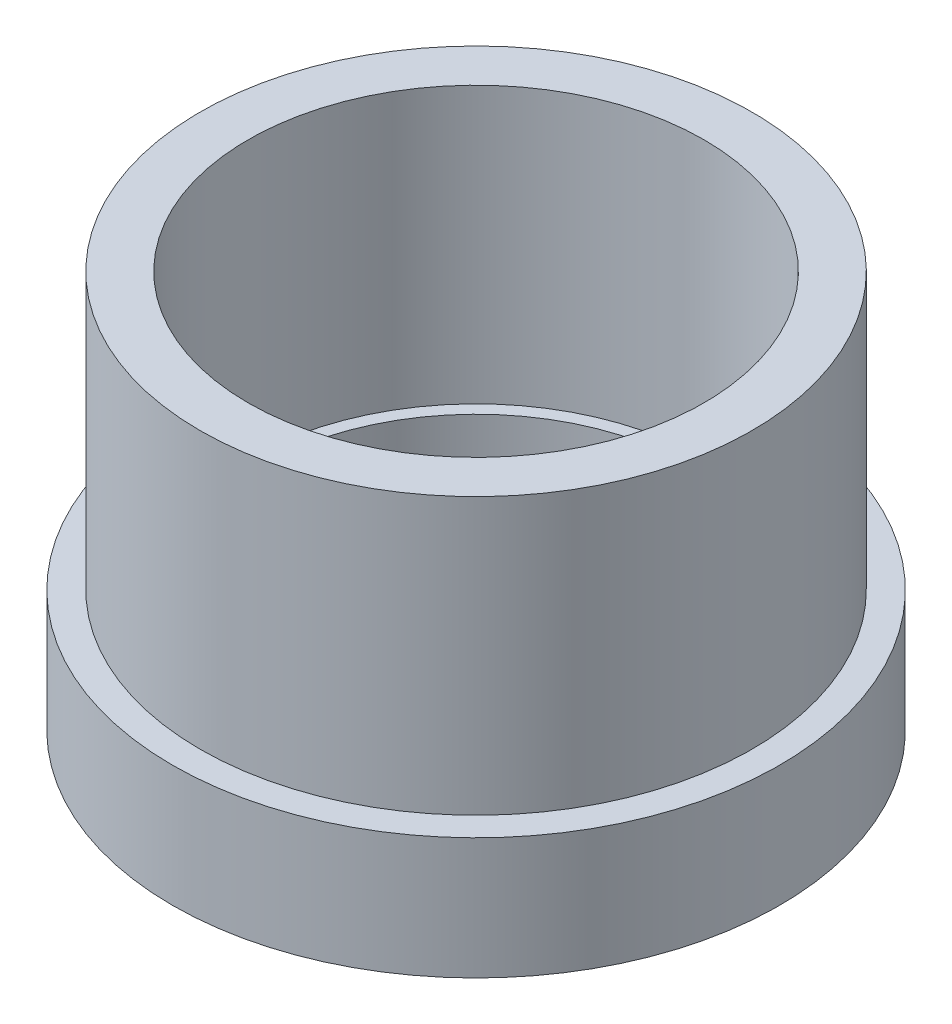
ISO-10303-21;
HEADER;
FILE_DESCRIPTION(('STEP AP214'),'2;1');
FILE_NAME('part.step','',(''),(''),'','','');
FILE_SCHEMA(('AUTOMOTIVE_DESIGN { 1 0 10303 214 1 1 1 1 }'));
ENDSEC;
DATA;
#1=APPLICATION_CONTEXT('core data for automotive mechanical design processes');
#2=APPLICATION_PROTOCOL_DEFINITION('international standard','automotive_design',2000,#1);
#3=PRODUCT_CONTEXT('',#1,'mechanical');
#4=PRODUCT('Part','Part','',(#3));
#5=PRODUCT_RELATED_PRODUCT_CATEGORY('part','',(#4));
#6=PRODUCT_DEFINITION_FORMATION('','',#4);
#7=PRODUCT_DEFINITION_CONTEXT('part definition',#1,'design');
#8=PRODUCT_DEFINITION('design','',#6,#7);
#9=PRODUCT_DEFINITION_SHAPE('','',#8);
#10=(LENGTH_UNIT() NAMED_UNIT(*) SI_UNIT(.MILLI.,.METRE.));
#11=(NAMED_UNIT(*) PLANE_ANGLE_UNIT() SI_UNIT($,.RADIAN.));
#12=(NAMED_UNIT(*) SI_UNIT($,.STERADIAN.) SOLID_ANGLE_UNIT());
#13=UNCERTAINTY_MEASURE_WITH_UNIT(LENGTH_MEASURE(1.E-05),#10,'distance_accuracy_value','');
#14=(GEOMETRIC_REPRESENTATION_CONTEXT(3) GLOBAL_UNCERTAINTY_ASSIGNED_CONTEXT((#13)) GLOBAL_UNIT_ASSIGNED_CONTEXT((#10,
#11,#12)) REPRESENTATION_CONTEXT('',''));
#15=CARTESIAN_POINT('',(0.,0.,0.));
#16=DIRECTION('',(0.,0.,1.));
#17=DIRECTION('',(1.,0.,0.));
#18=AXIS2_PLACEMENT_3D('',#15,#16,#17);
#19=CARTESIAN_POINT('',(39.,10.,0.));
#20=DIRECTION('',(0.,-1.,0.));
#21=DIRECTION('',(0.,0.,-1.));
#22=AXIS2_PLACEMENT_3D('',#19,#20,#21);
#23=PLANE('',#22);
#24=CARTESIAN_POINT('',(0.,9.99999999999999,0.));
#25=DIRECTION('',(0.,1.,0.));
#26=DIRECTION('',(0.,0.,1.));
#27=AXIS2_PLACEMENT_3D('',#24,#25,#26);
#28=CIRCLE('',#27,39.);
#29=CARTESIAN_POINT('',(0.,9.99999999999999,39.));
#30=VERTEX_POINT('',#29);
#31=EDGE_CURVE('E57',#30,#30,#28,.T.);
#32=ORIENTED_EDGE('',*,*,#31,.F.);
#33=EDGE_LOOP('',(#32));
#34=FACE_BOUND('',#33,.T.);
#35=CARTESIAN_POINT('',(0.,10.,0.));
#36=DIRECTION('',(0.,1.,0.));
#37=DIRECTION('',(0.,0.,1.));
#38=AXIS2_PLACEMENT_3D('',#35,#36,#37);
#39=CIRCLE('',#38,41.3);
#40=CARTESIAN_POINT('',(0.,10.,41.3));
#41=VERTEX_POINT('',#40);
#42=EDGE_CURVE('E89',#41,#41,#39,.T.);
#43=ORIENTED_EDGE('',*,*,#42,.T.);
#44=EDGE_LOOP('',(#43));
#45=FACE_BOUND('',#44,.T.);
#46=ADVANCED_FACE('F43',(#34,#45),#23,.F.);
#47=CARTESIAN_POINT('',(41.5,0.,0.));
#48=DIRECTION('',(0.,1.,0.));
#49=DIRECTION('',(0.,0.,1.));
#50=AXIS2_PLACEMENT_3D('',#47,#48,#49);
#51=PLANE('',#50);
#52=CARTESIAN_POINT('',(0.,0.,0.));
#53=DIRECTION('',(0.,1.,0.));
#54=DIRECTION('',(0.,0.,1.));
#55=AXIS2_PLACEMENT_3D('',#52,#53,#54);
#56=CIRCLE('',#55,41.5);
#57=CARTESIAN_POINT('',(0.,0.,41.5));
#58=VERTEX_POINT('',#57);
#59=EDGE_CURVE('E62',#58,#58,#56,.T.);
#60=ORIENTED_EDGE('',*,*,#59,.F.);
#61=EDGE_LOOP('',(#60));
#62=FACE_BOUND('',#61,.T.);
#63=CARTESIAN_POINT('',(0.,0.,0.));
#64=DIRECTION('',(0.,1.,0.));
#65=DIRECTION('',(0.,0.,1.));
#66=AXIS2_PLACEMENT_3D('',#63,#64,#65);
#67=CIRCLE('',#66,39.);
#68=CARTESIAN_POINT('',(0.,0.,39.));
#69=VERTEX_POINT('',#68);
#70=EDGE_CURVE('E47',#69,#69,#67,.T.);
#71=ORIENTED_EDGE('',*,*,#70,.T.);
#72=EDGE_LOOP('',(#71));
#73=FACE_BOUND('',#72,.T.);
#74=ADVANCED_FACE('F45',(#62,#73),#51,.F.);
#75=CARTESIAN_POINT('',(0.,83.5208362070746,0.));
#76=DIRECTION('',(0.,1.,0.));
#77=DIRECTION('',(0.,0.,1.));
#78=AXIS2_PLACEMENT_3D('',#75,#76,#77);
#79=CYLINDRICAL_SURFACE('',#78,39.);
#80=ORIENTED_EDGE('',*,*,#70,.F.);
#81=EDGE_LOOP('',(#80));
#82=FACE_BOUND('',#81,.T.);
#83=ORIENTED_EDGE('',*,*,#31,.T.);
#84=EDGE_LOOP('',(#83));
#85=FACE_BOUND('',#84,.T.);
#86=ADVANCED_FACE('F81',(#82,#85),#79,.F.);
#87=CARTESIAN_POINT('',(0.,10.,0.));
#88=DIRECTION('',(0.,1.,0.));
#89=DIRECTION('',(0.,0.,1.));
#90=AXIS2_PLACEMENT_3D('',#87,#88,#89);
#91=CIRCLE('',#90,50.);
#92=CARTESIAN_POINT('',(0.,10.,50.));
#93=VERTEX_POINT('',#92);
#94=EDGE_CURVE('E10',#93,#93,#91,.T.);
#95=ORIENTED_EDGE('',*,*,#94,.F.);
#96=EDGE_LOOP('',(#95));
#97=FACE_BOUND('',#96,.T.);
#98=CARTESIAN_POINT('',(0.,9.99999999999999,0.));
#99=DIRECTION('',(0.,1.,0.));
#100=DIRECTION('',(0.,0.,1.));
#101=AXIS2_PLACEMENT_3D('',#98,#99,#100);
#102=CIRCLE('',#101,55.);
#103=CARTESIAN_POINT('',(0.,9.99999999999999,55.));
#104=VERTEX_POINT('',#103);
#105=EDGE_CURVE('E74',#104,#104,#102,.T.);
#106=ORIENTED_EDGE('',*,*,#105,.T.);
#107=EDGE_LOOP('',(#106));
#108=FACE_BOUND('',#107,.T.);
#109=ADVANCED_FACE('F86',(#97,#108),#23,.F.);
#110=CARTESIAN_POINT('',(0.,83.5208362070746,0.));
#111=DIRECTION('',(0.,1.,0.));
#112=DIRECTION('',(0.,0.,1.));
#113=AXIS2_PLACEMENT_3D('',#110,#111,#112);
#114=CYLINDRICAL_SURFACE('',#113,55.);
#115=ORIENTED_EDGE('',*,*,#105,.F.);
#116=EDGE_LOOP('',(#115));
#117=FACE_BOUND('',#116,.T.);
#118=CARTESIAN_POINT('',(0.,-12.,0.));
#119=DIRECTION('',(0.,1.,0.));
#120=DIRECTION('',(0.,0.,1.));
#121=AXIS2_PLACEMENT_3D('',#118,#119,#120);
#122=CIRCLE('',#121,55.);
#123=CARTESIAN_POINT('',(0.,-12.,55.));
#124=VERTEX_POINT('',#123);
#125=EDGE_CURVE('E70',#124,#124,#122,.T.);
#126=ORIENTED_EDGE('',*,*,#125,.T.);
#127=EDGE_LOOP('',(#126));
#128=FACE_BOUND('',#127,.T.);
#129=ADVANCED_FACE('F136',(#117,#128),#114,.T.);
#130=CARTESIAN_POINT('',(55.,-12.,0.));
#131=DIRECTION('',(0.,1.,0.));
#132=DIRECTION('',(0.,0.,1.));
#133=AXIS2_PLACEMENT_3D('',#130,#131,#132);
#134=PLANE('',#133);
#135=CARTESIAN_POINT('',(0.,-12.,48.25));
#136=DIRECTION('',(0.,-1.,0.));
#137=DIRECTION('',(0.,0.,-1.));
#138=AXIS2_PLACEMENT_3D('',#135,#136,#137);
#139=CIRCLE('',#138,1.6);
#140=CARTESIAN_POINT('',(0.,-12.,46.65));
#141=VERTEX_POINT('',#140);
#142=EDGE_CURVE('E99',#141,#141,#139,.T.);
#143=ORIENTED_EDGE('',*,*,#142,.F.);
#144=EDGE_LOOP('',(#143));
#145=FACE_BOUND('',#144,.T.);
#146=CARTESIAN_POINT('',(-48.25,-12.,5.05391923797544E-13));
#147=DIRECTION('',(0.,-1.,0.));
#148=DIRECTION('',(0.,0.,-1.));
#149=AXIS2_PLACEMENT_3D('',#146,#147,#148);
#150=CIRCLE('',#149,1.6);
#151=CARTESIAN_POINT('',(-48.25,-12.,-1.59999999999949));
#152=VERTEX_POINT('',#151);
#153=EDGE_CURVE('E122',#152,#152,#150,.T.);
#154=ORIENTED_EDGE('',*,*,#153,.F.);
#155=EDGE_LOOP('',(#154));
#156=FACE_BOUND('',#155,.T.);
#157=CARTESIAN_POINT('',(-3.36927949198362E-13,-12.,-48.25));
#158=DIRECTION('',(0.,-1.,0.));
#159=DIRECTION('',(0.,0.,-1.));
#160=AXIS2_PLACEMENT_3D('',#157,#158,#159);
#161=CIRCLE('',#160,1.6);
#162=CARTESIAN_POINT('',(-3.36927949198362E-13,-12.,-49.85));
#163=VERTEX_POINT('',#162);
#164=EDGE_CURVE('E114',#163,#163,#161,.T.);
#165=ORIENTED_EDGE('',*,*,#164,.F.);
#166=EDGE_LOOP('',(#165));
#167=FACE_BOUND('',#166,.T.);
#168=CARTESIAN_POINT('',(48.25,-12.,-1.68463974599181E-13));
#169=DIRECTION('',(0.,-1.,0.));
#170=DIRECTION('',(0.,0.,-1.));
#171=AXIS2_PLACEMENT_3D('',#168,#169,#170);
#172=CIRCLE('',#171,1.6);
#173=CARTESIAN_POINT('',(48.25,-12.,-1.60000000000017));
#174=VERTEX_POINT('',#173);
#175=EDGE_CURVE('E106',#174,#174,#172,.T.);
#176=ORIENTED_EDGE('',*,*,#175,.F.);
#177=EDGE_LOOP('',(#176));
#178=FACE_BOUND('',#177,.T.);
#179=ORIENTED_EDGE('',*,*,#125,.F.);
#180=EDGE_LOOP('',(#179));
#181=FACE_BOUND('',#180,.T.);
#182=CARTESIAN_POINT('',(0.,-12.,0.));
#183=DIRECTION('',(0.,1.,0.));
#184=DIRECTION('',(0.,0.,1.));
#185=AXIS2_PLACEMENT_3D('',#182,#183,#184);
#186=CIRCLE('',#185,41.5);
#187=CARTESIAN_POINT('',(0.,-12.,41.5));
#188=VERTEX_POINT('',#187);
#189=EDGE_CURVE('E66',#188,#188,#186,.T.);
#190=ORIENTED_EDGE('',*,*,#189,.T.);
#191=EDGE_LOOP('',(#190));
#192=FACE_BOUND('',#191,.T.);
#193=ADVANCED_FACE('F132',(#145,#156,#167,#178,#181,#192),#134,.F.);
#194=CARTESIAN_POINT('',(0.,83.5208362070746,0.));
#195=DIRECTION('',(0.,1.,0.));
#196=DIRECTION('',(0.,0.,1.));
#197=AXIS2_PLACEMENT_3D('',#194,#195,#196);
#198=CYLINDRICAL_SURFACE('',#197,41.5);
#199=ORIENTED_EDGE('',*,*,#189,.F.);
#200=EDGE_LOOP('',(#199));
#201=FACE_BOUND('',#200,.T.);
#202=ORIENTED_EDGE('',*,*,#59,.T.);
#203=EDGE_LOOP('',(#202));
#204=FACE_BOUND('',#203,.T.);
#205=ADVANCED_FACE('F135',(#201,#204),#198,.F.);
#206=CARTESIAN_POINT('',(0.,60.,0.));
#207=DIRECTION('',(0.,1.,0.));
#208=DIRECTION('',(0.,0.,1.));
#209=AXIS2_PLACEMENT_3D('',#206,#207,#208);
#210=PLANE('',#209);
#211=CARTESIAN_POINT('',(0.,60.,0.));
#212=DIRECTION('',(0.,1.,0.));
#213=DIRECTION('',(0.,0.,1.));
#214=AXIS2_PLACEMENT_3D('',#211,#212,#213);
#215=CIRCLE('',#214,50.);
#216=CARTESIAN_POINT('',(0.,60.,50.));
#217=VERTEX_POINT('',#216);
#218=EDGE_CURVE('E60',#217,#217,#215,.T.);
#219=ORIENTED_EDGE('',*,*,#218,.T.);
#220=EDGE_LOOP('',(#219));
#221=FACE_BOUND('',#220,.T.);
#222=CARTESIAN_POINT('',(0.,60.,0.));
#223=DIRECTION('',(0.,1.,0.));
#224=DIRECTION('',(0.,0.,1.));
#225=AXIS2_PLACEMENT_3D('',#222,#223,#224);
#226=CIRCLE('',#225,41.3);
#227=CARTESIAN_POINT('',(0.,60.,41.3));
#228=VERTEX_POINT('',#227);
#229=EDGE_CURVE('E92',#228,#228,#226,.T.);
#230=ORIENTED_EDGE('',*,*,#229,.F.);
#231=EDGE_LOOP('',(#230));
#232=FACE_BOUND('',#231,.T.);
#233=ADVANCED_FACE('F150',(#221,#232),#210,.T.);
#234=CARTESIAN_POINT('',(0.,60.,0.));
#235=DIRECTION('',(0.,-1.,0.));
#236=DIRECTION('',(0.,0.,-1.));
#237=AXIS2_PLACEMENT_3D('',#234,#235,#236);
#238=CYLINDRICAL_SURFACE('',#237,50.);
#239=ORIENTED_EDGE('',*,*,#218,.F.);
#240=EDGE_LOOP('',(#239));
#241=FACE_BOUND('',#240,.T.);
#242=ORIENTED_EDGE('',*,*,#94,.T.);
#243=EDGE_LOOP('',(#242));
#244=FACE_BOUND('',#243,.T.);
#245=ADVANCED_FACE('F167',(#241,#244),#238,.T.);
#246=CARTESIAN_POINT('',(0.,60.,0.));
#247=DIRECTION('',(0.,-1.,0.));
#248=DIRECTION('',(0.,0.,-1.));
#249=AXIS2_PLACEMENT_3D('',#246,#247,#248);
#250=CYLINDRICAL_SURFACE('',#249,41.3);
#251=ORIENTED_EDGE('',*,*,#229,.T.);
#252=EDGE_LOOP('',(#251));
#253=FACE_BOUND('',#252,.T.);
#254=ORIENTED_EDGE('',*,*,#42,.F.);
#255=EDGE_LOOP('',(#254));
#256=FACE_BOUND('',#255,.T.);
#257=ADVANCED_FACE('F170',(#253,#256),#250,.F.);
#258=CARTESIAN_POINT('',(48.25,-2.,-1.68463974599181E-13));
#259=DIRECTION('',(0.,-1.,0.));
#260=DIRECTION('',(0.,0.,-1.));
#261=AXIS2_PLACEMENT_3D('',#258,#259,#260);
#262=CYLINDRICAL_SURFACE('',#261,1.6);
#263=CARTESIAN_POINT('',(48.25,-2.,-1.68463974599181E-13));
#264=DIRECTION('',(0.,-1.,0.));
#265=DIRECTION('',(0.,0.,-1.));
#266=AXIS2_PLACEMENT_3D('',#263,#264,#265);
#267=CIRCLE('',#266,1.6);
#268=CARTESIAN_POINT('',(48.25,-2.,-1.60000000000017));
#269=VERTEX_POINT('',#268);
#270=EDGE_CURVE('E102',#269,#269,#267,.T.);
#271=ORIENTED_EDGE('',*,*,#270,.F.);
#272=EDGE_LOOP('',(#271));
#273=FACE_BOUND('',#272,.T.);
#274=ORIENTED_EDGE('',*,*,#175,.T.);
#275=EDGE_LOOP('',(#274));
#276=FACE_BOUND('',#275,.T.);
#277=ADVANCED_FACE('F177',(#273,#276),#262,.F.);
#278=CARTESIAN_POINT('',(48.25,-2.,-1.68463974599181E-13));
#279=DIRECTION('',(0.,-1.,0.));
#280=DIRECTION('',(0.,0.,-1.));
#281=AXIS2_PLACEMENT_3D('',#278,#279,#280);
#282=PLANE('',#281);
#283=ORIENTED_EDGE('',*,*,#270,.T.);
#284=EDGE_LOOP('',(#283));
#285=FACE_BOUND('',#284,.T.);
#286=ADVANCED_FACE('F179',(#285),#282,.T.);
#287=CARTESIAN_POINT('',(-3.36927949198362E-13,-2.,-48.25));
#288=DIRECTION('',(0.,-1.,0.));
#289=DIRECTION('',(0.,0.,-1.));
#290=AXIS2_PLACEMENT_3D('',#287,#288,#289);
#291=CYLINDRICAL_SURFACE('',#290,1.6);
#292=CARTESIAN_POINT('',(-3.36927949198362E-13,-2.,-48.25));
#293=DIRECTION('',(0.,-1.,0.));
#294=DIRECTION('',(0.,0.,-1.));
#295=AXIS2_PLACEMENT_3D('',#292,#293,#294);
#296=CIRCLE('',#295,1.6);
#297=CARTESIAN_POINT('',(-3.36927949198362E-13,-2.,-49.85));
#298=VERTEX_POINT('',#297);
#299=EDGE_CURVE('E110',#298,#298,#296,.T.);
#300=ORIENTED_EDGE('',*,*,#299,.F.);
#301=EDGE_LOOP('',(#300));
#302=FACE_BOUND('',#301,.T.);
#303=ORIENTED_EDGE('',*,*,#164,.T.);
#304=EDGE_LOOP('',(#303));
#305=FACE_BOUND('',#304,.T.);
#306=ADVANCED_FACE('F182',(#302,#305),#291,.F.);
#307=CARTESIAN_POINT('',(-3.36927949198362E-13,-2.,-48.25));
#308=DIRECTION('',(0.,-1.,0.));
#309=DIRECTION('',(0.,0.,-1.));
#310=AXIS2_PLACEMENT_3D('',#307,#308,#309);
#311=PLANE('',#310);
#312=ORIENTED_EDGE('',*,*,#299,.T.);
#313=EDGE_LOOP('',(#312));
#314=FACE_BOUND('',#313,.T.);
#315=ADVANCED_FACE('F187',(#314),#311,.T.);
#316=CARTESIAN_POINT('',(-48.25,-2.,5.05391923797544E-13));
#317=DIRECTION('',(0.,-1.,0.));
#318=DIRECTION('',(0.,0.,-1.));
#319=AXIS2_PLACEMENT_3D('',#316,#317,#318);
#320=CYLINDRICAL_SURFACE('',#319,1.6);
#321=CARTESIAN_POINT('',(-48.25,-2.,5.05391923797544E-13));
#322=DIRECTION('',(0.,-1.,0.));
#323=DIRECTION('',(0.,0.,-1.));
#324=AXIS2_PLACEMENT_3D('',#321,#322,#323);
#325=CIRCLE('',#324,1.6);
#326=CARTESIAN_POINT('',(-48.25,-2.,-1.59999999999949));
#327=VERTEX_POINT('',#326);
#328=EDGE_CURVE('E118',#327,#327,#325,.T.);
#329=ORIENTED_EDGE('',*,*,#328,.F.);
#330=EDGE_LOOP('',(#329));
#331=FACE_BOUND('',#330,.T.);
#332=ORIENTED_EDGE('',*,*,#153,.T.);
#333=EDGE_LOOP('',(#332));
#334=FACE_BOUND('',#333,.T.);
#335=ADVANCED_FACE('F190',(#331,#334),#320,.F.);
#336=CARTESIAN_POINT('',(-48.25,-2.,5.05391923797544E-13));
#337=DIRECTION('',(0.,-1.,0.));
#338=DIRECTION('',(0.,0.,-1.));
#339=AXIS2_PLACEMENT_3D('',#336,#337,#338);
#340=PLANE('',#339);
#341=ORIENTED_EDGE('',*,*,#328,.T.);
#342=EDGE_LOOP('',(#341));
#343=FACE_BOUND('',#342,.T.);
#344=ADVANCED_FACE('F195',(#343),#340,.T.);
#345=CARTESIAN_POINT('',(0.,-2.,48.25));
#346=DIRECTION('',(0.,-1.,0.));
#347=DIRECTION('',(0.,0.,-1.));
#348=AXIS2_PLACEMENT_3D('',#345,#346,#347);
#349=CYLINDRICAL_SURFACE('',#348,1.6);
#350=CARTESIAN_POINT('',(0.,-2.,48.25));
#351=DIRECTION('',(0.,-1.,0.));
#352=DIRECTION('',(0.,0.,-1.));
#353=AXIS2_PLACEMENT_3D('',#350,#351,#352);
#354=CIRCLE('',#353,1.6);
#355=CARTESIAN_POINT('',(0.,-2.,46.65));
#356=VERTEX_POINT('',#355);
#357=EDGE_CURVE('E93',#356,#356,#354,.T.);
#358=ORIENTED_EDGE('',*,*,#357,.F.);
#359=EDGE_LOOP('',(#358));
#360=FACE_BOUND('',#359,.T.);
#361=ORIENTED_EDGE('',*,*,#142,.T.);
#362=EDGE_LOOP('',(#361));
#363=FACE_BOUND('',#362,.T.);
#364=ADVANCED_FACE('F130',(#360,#363),#349,.F.);
#365=CARTESIAN_POINT('',(0.,-2.,48.25));
#366=DIRECTION('',(0.,-1.,0.));
#367=DIRECTION('',(0.,0.,-1.));
#368=AXIS2_PLACEMENT_3D('',#365,#366,#367);
#369=PLANE('',#368);
#370=ORIENTED_EDGE('',*,*,#357,.T.);
#371=EDGE_LOOP('',(#370));
#372=FACE_BOUND('',#371,.T.);
#373=ADVANCED_FACE('F204',(#372),#369,.T.);
#374=CLOSED_SHELL('',(#46,#74,#86,#109,#129,#193,#205,#233,#245,#257,#277,#286,#306,#315,#335,
#344,#364,#373));
#375=MANIFOLD_SOLID_BREP('B2',#374);
#376=ADVANCED_BREP_SHAPE_REPRESENTATION('',(#18,#375),#14);
#377=SHAPE_DEFINITION_REPRESENTATION(#9,#376);
ENDSEC;
END-ISO-10303-21;
